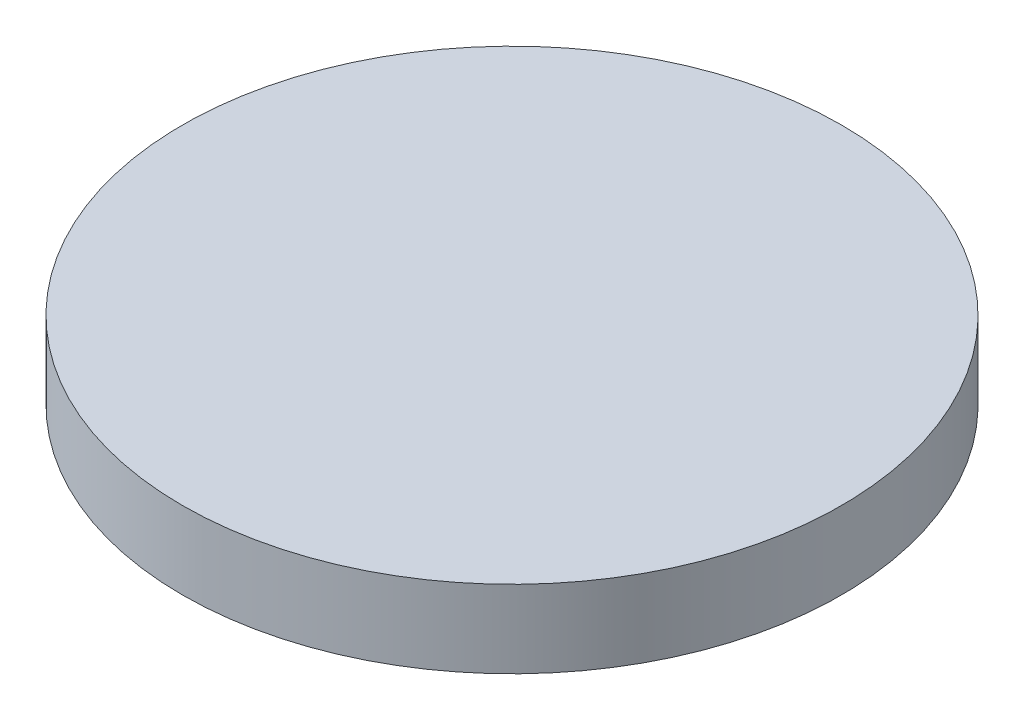
ISO-10303-21;
HEADER;
FILE_DESCRIPTION(('STEP AP214'),'2;1');
FILE_NAME('part.step','',(''),(''),'','','');
FILE_SCHEMA(('AUTOMOTIVE_DESIGN { 1 0 10303 214 1 1 1 1 }'));
ENDSEC;
DATA;
#1=APPLICATION_CONTEXT('core data for automotive mechanical design processes');
#2=APPLICATION_PROTOCOL_DEFINITION('international standard','automotive_design',2000,#1);
#3=PRODUCT_CONTEXT('',#1,'mechanical');
#4=PRODUCT('Part','Part','',(#3));
#5=PRODUCT_RELATED_PRODUCT_CATEGORY('part','',(#4));
#6=PRODUCT_DEFINITION_FORMATION('','',#4);
#7=PRODUCT_DEFINITION_CONTEXT('part definition',#1,'design');
#8=PRODUCT_DEFINITION('design','',#6,#7);
#9=PRODUCT_DEFINITION_SHAPE('','',#8);
#10=(LENGTH_UNIT() NAMED_UNIT(*) SI_UNIT(.MILLI.,.METRE.));
#11=(NAMED_UNIT(*) PLANE_ANGLE_UNIT() SI_UNIT($,.RADIAN.));
#12=(NAMED_UNIT(*) SI_UNIT($,.STERADIAN.) SOLID_ANGLE_UNIT());
#13=UNCERTAINTY_MEASURE_WITH_UNIT(LENGTH_MEASURE(1.E-05),#10,'distance_accuracy_value','');
#14=(GEOMETRIC_REPRESENTATION_CONTEXT(3) GLOBAL_UNCERTAINTY_ASSIGNED_CONTEXT((#13)) GLOBAL_UNIT_ASSIGNED_CONTEXT((#10,
#11,#12)) REPRESENTATION_CONTEXT('',''));
#15=CARTESIAN_POINT('',(0.,0.,0.));
#16=DIRECTION('',(0.,0.,1.));
#17=DIRECTION('',(1.,0.,0.));
#18=AXIS2_PLACEMENT_3D('',#15,#16,#17);
#19=CARTESIAN_POINT('',(0.,5.,0.));
#20=DIRECTION('',(0.,-1.,0.));
#21=DIRECTION('',(0.,0.,-1.));
#22=AXIS2_PLACEMENT_3D('',#19,#20,#21);
#23=CYLINDRICAL_SURFACE('',#22,21.2577953625802);
#24=CARTESIAN_POINT('',(0.,5.,0.));
#25=DIRECTION('',(0.,1.,0.));
#26=DIRECTION('',(0.,0.,1.));
#27=AXIS2_PLACEMENT_3D('',#24,#25,#26);
#28=CIRCLE('',#27,21.2577953625802);
#29=CARTESIAN_POINT('',(0.,5.,21.2577953625802));
#30=VERTEX_POINT('',#29);
#31=EDGE_CURVE('E10',#30,#30,#28,.T.);
#32=ORIENTED_EDGE('',*,*,#31,.F.);
#33=EDGE_LOOP('',(#32));
#34=FACE_BOUND('',#33,.T.);
#35=CARTESIAN_POINT('',(0.,0.,0.));
#36=DIRECTION('',(0.,1.,0.));
#37=DIRECTION('',(0.,0.,1.));
#38=AXIS2_PLACEMENT_3D('',#35,#36,#37);
#39=CIRCLE('',#38,21.2577953625802);
#40=CARTESIAN_POINT('',(0.,0.,21.2577953625802));
#41=VERTEX_POINT('',#40);
#42=EDGE_CURVE('E34',#41,#41,#39,.T.);
#43=ORIENTED_EDGE('',*,*,#42,.T.);
#44=EDGE_LOOP('',(#43));
#45=FACE_BOUND('',#44,.T.);
#46=ADVANCED_FACE('F31',(#34,#45),#23,.T.);
#47=CARTESIAN_POINT('',(0.,5.,0.));
#48=DIRECTION('',(0.,1.,0.));
#49=DIRECTION('',(0.,0.,1.));
#50=AXIS2_PLACEMENT_3D('',#47,#48,#49);
#51=PLANE('',#50);
#52=ORIENTED_EDGE('',*,*,#31,.T.);
#53=EDGE_LOOP('',(#52));
#54=FACE_BOUND('',#53,.T.);
#55=ADVANCED_FACE('F46',(#54),#51,.T.);
#56=CARTESIAN_POINT('',(0.,0.,0.));
#57=DIRECTION('',(0.,1.,0.));
#58=DIRECTION('',(0.,0.,1.));
#59=AXIS2_PLACEMENT_3D('',#56,#57,#58);
#60=PLANE('',#59);
#61=ORIENTED_EDGE('',*,*,#42,.F.);
#62=EDGE_LOOP('',(#61));
#63=FACE_BOUND('',#62,.T.);
#64=ADVANCED_FACE('F44',(#63),#60,.F.);
#65=CLOSED_SHELL('',(#46,#55,#64));
#66=MANIFOLD_SOLID_BREP('B2',#65);
#67=ADVANCED_BREP_SHAPE_REPRESENTATION('',(#18,#66),#14);
#68=SHAPE_DEFINITION_REPRESENTATION(#9,#67);
ENDSEC;
END-ISO-10303-21;
